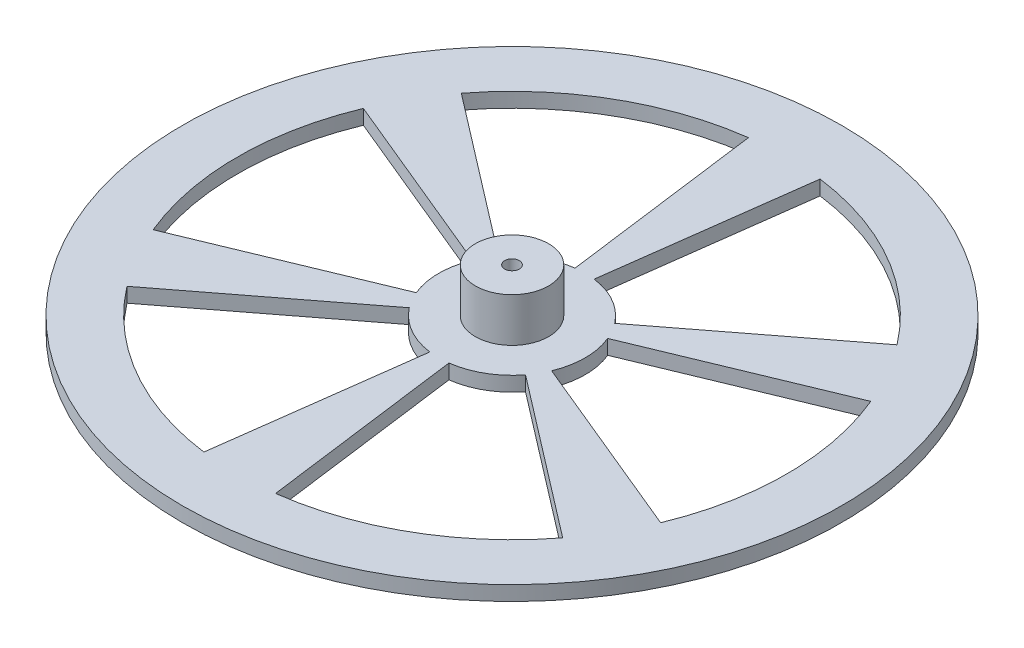
ISO-10303-21;
HEADER;
FILE_DESCRIPTION(('STEP AP214'),'2;1');
FILE_NAME('part.step','',(''),(''),'','','');
FILE_SCHEMA(('AUTOMOTIVE_DESIGN { 1 0 10303 214 1 1 1 1 }'));
ENDSEC;
DATA;
#1=APPLICATION_CONTEXT('core data for automotive mechanical design processes');
#2=APPLICATION_PROTOCOL_DEFINITION('international standard','automotive_design',2000,#1);
#3=PRODUCT_CONTEXT('',#1,'mechanical');
#4=PRODUCT('Part','Part','',(#3));
#5=PRODUCT_RELATED_PRODUCT_CATEGORY('part','',(#4));
#6=PRODUCT_DEFINITION_FORMATION('','',#4);
#7=PRODUCT_DEFINITION_CONTEXT('part definition',#1,'design');
#8=PRODUCT_DEFINITION('design','',#6,#7);
#9=PRODUCT_DEFINITION_SHAPE('','',#8);
#10=(LENGTH_UNIT() NAMED_UNIT(*) SI_UNIT(.MILLI.,.METRE.));
#11=(NAMED_UNIT(*) PLANE_ANGLE_UNIT() SI_UNIT($,.RADIAN.));
#12=(NAMED_UNIT(*) SI_UNIT($,.STERADIAN.) SOLID_ANGLE_UNIT());
#13=UNCERTAINTY_MEASURE_WITH_UNIT(LENGTH_MEASURE(1.E-05),#10,'distance_accuracy_value','');
#14=(GEOMETRIC_REPRESENTATION_CONTEXT(3) GLOBAL_UNCERTAINTY_ASSIGNED_CONTEXT((#13)) GLOBAL_UNIT_ASSIGNED_CONTEXT((#10,
#11,#12)) REPRESENTATION_CONTEXT('',''));
#15=CARTESIAN_POINT('',(0.,0.,0.));
#16=DIRECTION('',(0.,0.,1.));
#17=DIRECTION('',(1.,0.,0.));
#18=AXIS2_PLACEMENT_3D('',#15,#16,#17);
#19=CARTESIAN_POINT('',(0.,4.,0.));
#20=DIRECTION('',(0.,-1.,0.));
#21=DIRECTION('',(0.,0.,-1.));
#22=AXIS2_PLACEMENT_3D('',#19,#20,#21);
#23=CYLINDRICAL_SURFACE('',#22,90.);
#24=CARTESIAN_POINT('',(0.,4.,0.));
#25=DIRECTION('',(0.,1.,0.));
#26=DIRECTION('',(0.,0.,1.));
#27=AXIS2_PLACEMENT_3D('',#24,#25,#26);
#28=CIRCLE('',#27,90.);
#29=CARTESIAN_POINT('',(0.,4.,90.));
#30=VERTEX_POINT('',#29);
#31=EDGE_CURVE('E11',#30,#30,#28,.T.);
#32=ORIENTED_EDGE('',*,*,#31,.F.);
#33=EDGE_LOOP('',(#32));
#34=FACE_BOUND('',#33,.T.);
#35=CARTESIAN_POINT('',(0.,0.,0.));
#36=DIRECTION('',(0.,1.,0.));
#37=DIRECTION('',(0.,0.,1.));
#38=AXIS2_PLACEMENT_3D('',#35,#36,#37);
#39=CIRCLE('',#38,90.);
#40=CARTESIAN_POINT('',(0.,0.,90.));
#41=VERTEX_POINT('',#40);
#42=EDGE_CURVE('E41',#41,#41,#39,.T.);
#43=ORIENTED_EDGE('',*,*,#42,.T.);
#44=EDGE_LOOP('',(#43));
#45=FACE_BOUND('',#44,.T.);
#46=ADVANCED_FACE('F38',(#34,#45),#23,.T.);
#47=CARTESIAN_POINT('',(0.,4.,0.));
#48=DIRECTION('',(0.,1.,0.));
#49=DIRECTION('',(0.,0.,1.));
#50=AXIS2_PLACEMENT_3D('',#47,#48,#49);
#51=PLANE('',#50);
#52=CARTESIAN_POINT('',(0.,4.,0.));
#53=DIRECTION('',(0.,1.,0.));
#54=DIRECTION('',(0.,0.,1.));
#55=AXIS2_PLACEMENT_3D('',#52,#53,#54);
#56=CIRCLE('',#55,10.);
#57=CARTESIAN_POINT('',(0.,4.,10.));
#58=VERTEX_POINT('',#57);
#59=EDGE_CURVE('E228',#58,#58,#56,.T.);
#60=ORIENTED_EDGE('',*,*,#59,.F.);
#61=EDGE_LOOP('',(#60));
#62=FACE_BOUND('',#61,.T.);
#63=DIRECTION('',(-0.793353340291232,0.,0.608761429008725));
#64=VECTOR('',#63,1.);
#65=CARTESIAN_POINT('',(0.,4.,0.));
#66=LINE('',#65,#64);
#67=CARTESIAN_POINT('',(-15.8670668058246,4.,12.1752285801745));
#68=VERTEX_POINT('',#67);
#69=CARTESIAN_POINT('',(-59.5015005218424,4.,45.6571071756544));
#70=VERTEX_POINT('',#69);
#71=EDGE_CURVE('E52',#68,#70,#66,.T.);
#72=ORIENTED_EDGE('',*,*,#71,.F.);
#73=CARTESIAN_POINT('',(0.,4.,0.));
#74=DIRECTION('',(0.,1.,0.));
#75=DIRECTION('',(0.866025403784436,0.,-0.500000000000004));
#76=AXIS2_PLACEMENT_3D('',#73,#74,#75);
#77=CIRCLE('',#76,20.);
#78=CARTESIAN_POINT('',(-2.61052384440089,4.,19.8288972274762));
#79=VERTEX_POINT('',#78);
#80=EDGE_CURVE('E279',#68,#79,#77,.T.);
#81=ORIENTED_EDGE('',*,*,#80,.T.);
#82=DIRECTION('',(-0.130526192220045,0.,0.991444861373812));
#83=VECTOR('',#82,1.);
#84=CARTESIAN_POINT('',(0.,4.,0.));
#85=LINE('',#84,#83);
#86=CARTESIAN_POINT('',(-9.78946441650336,4.,74.3583646030359));
#87=VERTEX_POINT('',#86);
#88=EDGE_CURVE('E293',#79,#87,#85,.T.);
#89=ORIENTED_EDGE('',*,*,#88,.T.);
#90=CARTESIAN_POINT('',(0.,4.,0.));
#91=DIRECTION('',(0.,1.,0.));
#92=DIRECTION('',(0.866025403784436,0.,-0.500000000000004));
#93=AXIS2_PLACEMENT_3D('',#90,#91,#92);
#94=CIRCLE('',#93,75.);
#95=EDGE_CURVE('E289',#70,#87,#94,.T.);
#96=ORIENTED_EDGE('',*,*,#95,.F.);
#97=EDGE_LOOP('',(#72,#81,#89,#96));
#98=FACE_BOUND('',#97,.T.);
#99=DIRECTION('',(0.130526192220053,0.,0.99144486137381));
#100=VECTOR('',#99,1.);
#101=CARTESIAN_POINT('',(0.,4.,0.));
#102=LINE('',#101,#100);
#103=CARTESIAN_POINT('',(2.61052384440105,4.,19.8288972274762));
#104=VERTEX_POINT('',#103);
#105=CARTESIAN_POINT('',(9.78946441650394,4.,74.3583646030358));
#106=VERTEX_POINT('',#105);
#107=EDGE_CURVE('E60',#104,#106,#102,.T.);
#108=ORIENTED_EDGE('',*,*,#107,.F.);
#109=CARTESIAN_POINT('',(0.,4.,0.));
#110=DIRECTION('',(0.,1.,0.));
#111=DIRECTION('',(0.,0.,-1.));
#112=AXIS2_PLACEMENT_3D('',#109,#110,#111);
#113=CIRCLE('',#112,20.);
#114=CARTESIAN_POINT('',(15.8670668058247,4.,12.1752285801744));
#115=VERTEX_POINT('',#114);
#116=EDGE_CURVE('E310',#104,#115,#113,.T.);
#117=ORIENTED_EDGE('',*,*,#116,.T.);
#118=DIRECTION('',(0.793353340291237,0.,0.608761429008719));
#119=VECTOR('',#118,1.);
#120=CARTESIAN_POINT('',(0.,4.,0.));
#121=LINE('',#120,#119);
#122=CARTESIAN_POINT('',(59.5015005218427,4.,45.6571071756539));
#123=VERTEX_POINT('',#122);
#124=EDGE_CURVE('E323',#115,#123,#121,.T.);
#125=ORIENTED_EDGE('',*,*,#124,.T.);
#126=CARTESIAN_POINT('',(0.,4.,0.));
#127=DIRECTION('',(0.,1.,0.));
#128=DIRECTION('',(0.,0.,-1.));
#129=AXIS2_PLACEMENT_3D('',#126,#127,#128);
#130=CIRCLE('',#129,75.);
#131=EDGE_CURVE('E320',#106,#123,#130,.T.);
#132=ORIENTED_EDGE('',*,*,#131,.F.);
#133=EDGE_LOOP('',(#108,#117,#125,#132));
#134=FACE_BOUND('',#133,.T.);
#135=DIRECTION('',(0.793353340291228,0.,-0.608761429008731));
#136=VECTOR('',#135,1.);
#137=CARTESIAN_POINT('',(0.,4.,0.));
#138=LINE('',#137,#136);
#139=CARTESIAN_POINT('',(15.8670668058246,4.,-12.1752285801746));
#140=VERTEX_POINT('',#139);
#141=CARTESIAN_POINT('',(59.5015005218421,4.,-45.6571071756548));
#142=VERTEX_POINT('',#141);
#143=EDGE_CURVE('E205',#140,#142,#138,.T.);
#144=ORIENTED_EDGE('',*,*,#143,.F.);
#145=CARTESIAN_POINT('',(0.,4.,0.));
#146=DIRECTION('',(0.,1.,0.));
#147=DIRECTION('',(-0.866025403784433,0.,0.50000000000001));
#148=AXIS2_PLACEMENT_3D('',#145,#146,#147);
#149=CIRCLE('',#148,20.);
#150=CARTESIAN_POINT('',(2.61052384440075,4.,-19.8288972274762));
#151=VERTEX_POINT('',#150);
#152=EDGE_CURVE('E222',#140,#151,#149,.T.);
#153=ORIENTED_EDGE('',*,*,#152,.T.);
#154=DIRECTION('',(0.130526192220038,0.,-0.991444861373812));
#155=VECTOR('',#154,1.);
#156=CARTESIAN_POINT('',(0.,4.,0.));
#157=LINE('',#156,#155);
#158=CARTESIAN_POINT('',(9.78946441650284,4.,-74.3583646030359));
#159=VERTEX_POINT('',#158);
#160=EDGE_CURVE('E225',#151,#159,#157,.T.);
#161=ORIENTED_EDGE('',*,*,#160,.T.);
#162=CARTESIAN_POINT('',(0.,4.,0.));
#163=DIRECTION('',(0.,1.,0.));
#164=DIRECTION('',(-0.866025403784433,0.,0.50000000000001));
#165=AXIS2_PLACEMENT_3D('',#162,#163,#164);
#166=CIRCLE('',#165,75.);
#167=EDGE_CURVE('E234',#142,#159,#166,.T.);
#168=ORIENTED_EDGE('',*,*,#167,.F.);
#169=EDGE_LOOP('',(#144,#153,#161,#168));
#170=FACE_BOUND('',#169,.T.);
#171=DIRECTION('',(0.923879532511291,0.,0.38268343236508));
#172=VECTOR('',#171,1.);
#173=CARTESIAN_POINT('',(0.,4.,0.));
#174=LINE('',#173,#172);
#175=CARTESIAN_POINT('',(18.4775906502258,4.,7.65366864730161));
#176=VERTEX_POINT('',#175);
#177=CARTESIAN_POINT('',(69.2909649383468,4.,28.701257427381));
#178=VERTEX_POINT('',#177);
#179=EDGE_CURVE('E241',#176,#178,#174,.T.);
#180=ORIENTED_EDGE('',*,*,#179,.F.);
#181=CARTESIAN_POINT('',(0.,4.,0.));
#182=DIRECTION('',(0.,1.,0.));
#183=DIRECTION('',(-0.866025403784443,0.,-0.499999999999992));
#184=AXIS2_PLACEMENT_3D('',#181,#182,#183);
#185=CIRCLE('',#184,20.);
#186=CARTESIAN_POINT('',(18.4775906502256,4.,-7.653668647302));
#187=VERTEX_POINT('',#186);
#188=EDGE_CURVE('E249',#176,#187,#185,.T.);
#189=ORIENTED_EDGE('',*,*,#188,.T.);
#190=DIRECTION('',(0.923879532511282,0.,-0.3826834323651));
#191=VECTOR('',#190,1.);
#192=CARTESIAN_POINT('',(0.,4.,0.));
#193=LINE('',#192,#191);
#194=CARTESIAN_POINT('',(69.2909649383462,4.,-28.7012574273825));
#195=VERTEX_POINT('',#194);
#196=EDGE_CURVE('E262',#187,#195,#193,.T.);
#197=ORIENTED_EDGE('',*,*,#196,.T.);
#198=CARTESIAN_POINT('',(0.,4.,0.));
#199=DIRECTION('',(0.,1.,0.));
#200=DIRECTION('',(-0.866025403784443,0.,-0.499999999999992));
#201=AXIS2_PLACEMENT_3D('',#198,#199,#200);
#202=CIRCLE('',#201,75.);
#203=EDGE_CURVE('E259',#178,#195,#202,.T.);
#204=ORIENTED_EDGE('',*,*,#203,.F.);
#205=EDGE_LOOP('',(#180,#189,#197,#204));
#206=FACE_BOUND('',#205,.T.);
#207=DIRECTION('',(-0.923879532511288,0.,-0.382683432365087));
#208=VECTOR('',#207,1.);
#209=CARTESIAN_POINT('',(0.,4.,0.));
#210=LINE('',#209,#208);
#211=CARTESIAN_POINT('',(-18.4775906502258,4.,-7.65366864730174));
#212=VERTEX_POINT('',#211);
#213=CARTESIAN_POINT('',(-69.2909649383466,4.,-28.7012574273815));
#214=VERTEX_POINT('',#213);
#215=EDGE_CURVE('E300',#212,#214,#210,.T.);
#216=ORIENTED_EDGE('',*,*,#215,.F.);
#217=CARTESIAN_POINT('',(0.,4.,0.));
#218=DIRECTION('',(0.,1.,0.));
#219=DIRECTION('',(0.86602540378444,0.,0.499999999999998));
#220=AXIS2_PLACEMENT_3D('',#217,#218,#219);
#221=CIRCLE('',#220,20.);
#222=CARTESIAN_POINT('',(-18.4775906502257,4.,7.65366864730188));
#223=VERTEX_POINT('',#222);
#224=EDGE_CURVE('E338',#212,#223,#221,.T.);
#225=ORIENTED_EDGE('',*,*,#224,.T.);
#226=DIRECTION('',(-0.923879532511285,0.,0.382683432365094));
#227=VECTOR('',#226,1.);
#228=CARTESIAN_POINT('',(0.,4.,0.));
#229=LINE('',#228,#227);
#230=CARTESIAN_POINT('',(-69.2909649383464,4.,28.701257427382));
#231=VERTEX_POINT('',#230);
#232=EDGE_CURVE('E351',#223,#231,#229,.T.);
#233=ORIENTED_EDGE('',*,*,#232,.T.);
#234=CARTESIAN_POINT('',(0.,4.,0.));
#235=DIRECTION('',(0.,1.,0.));
#236=DIRECTION('',(0.86602540378444,0.,0.499999999999998));
#237=AXIS2_PLACEMENT_3D('',#234,#235,#236);
#238=CIRCLE('',#237,75.);
#239=EDGE_CURVE('E348',#214,#231,#238,.T.);
#240=ORIENTED_EDGE('',*,*,#239,.F.);
#241=EDGE_LOOP('',(#216,#225,#233,#240));
#242=FACE_BOUND('',#241,.T.);
#243=DIRECTION('',(-0.130526192220053,0.,-0.99144486137381));
#244=VECTOR('',#243,1.);
#245=CARTESIAN_POINT('',(0.,4.,0.));
#246=LINE('',#245,#244);
#247=CARTESIAN_POINT('',(-2.61052384440105,4.,-19.8288972274762));
#248=VERTEX_POINT('',#247);
#249=CARTESIAN_POINT('',(-9.78946441650394,4.,-74.3583646030358));
#250=VERTEX_POINT('',#249);
#251=EDGE_CURVE('E358',#248,#250,#246,.T.);
#252=ORIENTED_EDGE('',*,*,#251,.F.);
#253=CARTESIAN_POINT('',(0.,4.,0.));
#254=DIRECTION('',(0.,1.,0.));
#255=DIRECTION('',(0.,0.,1.));
#256=AXIS2_PLACEMENT_3D('',#253,#254,#255);
#257=CIRCLE('',#256,20.);
#258=CARTESIAN_POINT('',(-15.8670668058247,4.,-12.1752285801744));
#259=VERTEX_POINT('',#258);
#260=EDGE_CURVE('E369',#248,#259,#257,.T.);
#261=ORIENTED_EDGE('',*,*,#260,.T.);
#262=DIRECTION('',(-0.793353340291237,0.,-0.608761429008719));
#263=VECTOR('',#262,1.);
#264=CARTESIAN_POINT('',(0.,4.,0.));
#265=LINE('',#264,#263);
#266=CARTESIAN_POINT('',(-59.5015005218427,4.,-45.6571071756539));
#267=VERTEX_POINT('',#266);
#268=EDGE_CURVE('E382',#259,#267,#265,.T.);
#269=ORIENTED_EDGE('',*,*,#268,.T.);
#270=CARTESIAN_POINT('',(0.,4.,0.));
#271=DIRECTION('',(0.,1.,0.));
#272=DIRECTION('',(0.,0.,1.));
#273=AXIS2_PLACEMENT_3D('',#270,#271,#272);
#274=CIRCLE('',#273,75.);
#275=EDGE_CURVE('E379',#250,#267,#274,.T.);
#276=ORIENTED_EDGE('',*,*,#275,.F.);
#277=EDGE_LOOP('',(#252,#261,#269,#276));
#278=FACE_BOUND('',#277,.T.);
#279=ORIENTED_EDGE('',*,*,#31,.T.);
#280=EDGE_LOOP('',(#279));
#281=FACE_BOUND('',#280,.T.);
#282=ADVANCED_FACE('F402',(#62,#98,#134,#170,#206,#242,#278,#281),#51,.T.);
#283=CARTESIAN_POINT('',(0.,0.,0.));
#284=DIRECTION('',(0.,1.,0.));
#285=DIRECTION('',(0.,0.,1.));
#286=AXIS2_PLACEMENT_3D('',#283,#284,#285);
#287=PLANE('',#286);
#288=CARTESIAN_POINT('',(0.,0.,0.));
#289=DIRECTION('',(0.,1.,0.));
#290=DIRECTION('',(0.866025403784436,0.,-0.500000000000004));
#291=AXIS2_PLACEMENT_3D('',#288,#289,#290);
#292=CIRCLE('',#291,20.);
#293=CARTESIAN_POINT('',(-15.8670668058246,0.,12.1752285801745));
#294=VERTEX_POINT('',#293);
#295=CARTESIAN_POINT('',(-2.61052384440089,0.,19.8288972274762));
#296=VERTEX_POINT('',#295);
#297=EDGE_CURVE('E285',#294,#296,#292,.T.);
#298=ORIENTED_EDGE('',*,*,#297,.F.);
#299=DIRECTION('',(-0.793353340291232,0.,0.608761429008725));
#300=VECTOR('',#299,1.);
#301=CARTESIAN_POINT('',(0.,0.,0.));
#302=LINE('',#301,#300);
#303=CARTESIAN_POINT('',(-59.5015005218424,0.,45.6571071756544));
#304=VERTEX_POINT('',#303);
#305=EDGE_CURVE('E275',#294,#304,#302,.T.);
#306=ORIENTED_EDGE('',*,*,#305,.T.);
#307=CARTESIAN_POINT('',(0.,0.,0.));
#308=DIRECTION('',(0.,1.,0.));
#309=DIRECTION('',(0.866025403784436,0.,-0.500000000000004));
#310=AXIS2_PLACEMENT_3D('',#307,#308,#309);
#311=CIRCLE('',#310,75.);
#312=CARTESIAN_POINT('',(-9.78946441650336,0.,74.3583646030359));
#313=VERTEX_POINT('',#312);
#314=EDGE_CURVE('E278',#304,#313,#311,.T.);
#315=ORIENTED_EDGE('',*,*,#314,.T.);
#316=DIRECTION('',(-0.130526192220045,0.,0.991444861373812));
#317=VECTOR('',#316,1.);
#318=CARTESIAN_POINT('',(0.,0.,0.));
#319=LINE('',#318,#317);
#320=EDGE_CURVE('E282',#296,#313,#319,.T.);
#321=ORIENTED_EDGE('',*,*,#320,.F.);
#322=EDGE_LOOP('',(#298,#306,#315,#321));
#323=FACE_BOUND('',#322,.T.);
#324=CARTESIAN_POINT('',(0.,0.,0.));
#325=DIRECTION('',(0.,1.,0.));
#326=DIRECTION('',(0.,0.,-1.));
#327=AXIS2_PLACEMENT_3D('',#324,#325,#326);
#328=CIRCLE('',#327,20.);
#329=CARTESIAN_POINT('',(2.61052384440105,0.,19.8288972274762));
#330=VERTEX_POINT('',#329);
#331=CARTESIAN_POINT('',(15.8670668058247,0.,12.1752285801744));
#332=VERTEX_POINT('',#331);
#333=EDGE_CURVE('E316',#330,#332,#328,.T.);
#334=ORIENTED_EDGE('',*,*,#333,.F.);
#335=DIRECTION('',(0.130526192220053,0.,0.99144486137381));
#336=VECTOR('',#335,1.);
#337=CARTESIAN_POINT('',(0.,0.,0.));
#338=LINE('',#337,#336);
#339=CARTESIAN_POINT('',(9.78946441650394,0.,74.3583646030358));
#340=VERTEX_POINT('',#339);
#341=EDGE_CURVE('E306',#330,#340,#338,.T.);
#342=ORIENTED_EDGE('',*,*,#341,.T.);
#343=CARTESIAN_POINT('',(0.,0.,0.));
#344=DIRECTION('',(0.,1.,0.));
#345=DIRECTION('',(0.,0.,-1.));
#346=AXIS2_PLACEMENT_3D('',#343,#344,#345);
#347=CIRCLE('',#346,75.);
#348=CARTESIAN_POINT('',(59.5015005218427,0.,45.6571071756539));
#349=VERTEX_POINT('',#348);
#350=EDGE_CURVE('E309',#340,#349,#347,.T.);
#351=ORIENTED_EDGE('',*,*,#350,.T.);
#352=DIRECTION('',(0.793353340291237,0.,0.608761429008719));
#353=VECTOR('',#352,1.);
#354=CARTESIAN_POINT('',(0.,0.,0.));
#355=LINE('',#354,#353);
#356=EDGE_CURVE('E313',#332,#349,#355,.T.);
#357=ORIENTED_EDGE('',*,*,#356,.F.);
#358=EDGE_LOOP('',(#334,#342,#351,#357));
#359=FACE_BOUND('',#358,.T.);
#360=CARTESIAN_POINT('',(0.,0.,0.));
#361=DIRECTION('',(0.,1.,0.));
#362=DIRECTION('',(-0.866025403784433,0.,0.50000000000001));
#363=AXIS2_PLACEMENT_3D('',#360,#361,#362);
#364=CIRCLE('',#363,20.);
#365=CARTESIAN_POINT('',(15.8670668058246,0.,-12.1752285801746));
#366=VERTEX_POINT('',#365);
#367=CARTESIAN_POINT('',(2.61052384440075,0.,-19.8288972274762));
#368=VERTEX_POINT('',#367);
#369=EDGE_CURVE('E210',#366,#368,#364,.T.);
#370=ORIENTED_EDGE('',*,*,#369,.F.);
#371=DIRECTION('',(0.793353340291228,0.,-0.608761429008731));
#372=VECTOR('',#371,1.);
#373=CARTESIAN_POINT('',(0.,0.,0.));
#374=LINE('',#373,#372);
#375=CARTESIAN_POINT('',(59.5015005218421,0.,-45.6571071756548));
#376=VERTEX_POINT('',#375);
#377=EDGE_CURVE('E202',#366,#376,#374,.T.);
#378=ORIENTED_EDGE('',*,*,#377,.T.);
#379=CARTESIAN_POINT('',(0.,0.,0.));
#380=DIRECTION('',(0.,1.,0.));
#381=DIRECTION('',(-0.866025403784433,0.,0.50000000000001));
#382=AXIS2_PLACEMENT_3D('',#379,#380,#381);
#383=CIRCLE('',#382,75.);
#384=CARTESIAN_POINT('',(9.78946441650284,0.,-74.3583646030359));
#385=VERTEX_POINT('',#384);
#386=EDGE_CURVE('E213',#376,#385,#383,.T.);
#387=ORIENTED_EDGE('',*,*,#386,.T.);
#388=DIRECTION('',(0.130526192220038,0.,-0.991444861373812));
#389=VECTOR('',#388,1.);
#390=CARTESIAN_POINT('',(0.,0.,0.));
#391=LINE('',#390,#389);
#392=EDGE_CURVE('E218',#368,#385,#391,.T.);
#393=ORIENTED_EDGE('',*,*,#392,.F.);
#394=EDGE_LOOP('',(#370,#378,#387,#393));
#395=FACE_BOUND('',#394,.T.);
#396=CARTESIAN_POINT('',(0.,0.,0.));
#397=DIRECTION('',(0.,1.,0.));
#398=DIRECTION('',(-0.866025403784443,0.,-0.499999999999992));
#399=AXIS2_PLACEMENT_3D('',#396,#397,#398);
#400=CIRCLE('',#399,20.);
#401=CARTESIAN_POINT('',(18.4775906502258,0.,7.65366864730161));
#402=VERTEX_POINT('',#401);
#403=CARTESIAN_POINT('',(18.4775906502256,0.,-7.653668647302));
#404=VERTEX_POINT('',#403);
#405=EDGE_CURVE('E255',#402,#404,#400,.T.);
#406=ORIENTED_EDGE('',*,*,#405,.F.);
#407=DIRECTION('',(0.923879532511291,0.,0.38268343236508));
#408=VECTOR('',#407,1.);
#409=CARTESIAN_POINT('',(0.,0.,0.));
#410=LINE('',#409,#408);
#411=CARTESIAN_POINT('',(69.2909649383468,0.,28.701257427381));
#412=VERTEX_POINT('',#411);
#413=EDGE_CURVE('E245',#402,#412,#410,.T.);
#414=ORIENTED_EDGE('',*,*,#413,.T.);
#415=CARTESIAN_POINT('',(0.,0.,0.));
#416=DIRECTION('',(0.,1.,0.));
#417=DIRECTION('',(-0.866025403784443,0.,-0.499999999999992));
#418=AXIS2_PLACEMENT_3D('',#415,#416,#417);
#419=CIRCLE('',#418,75.);
#420=CARTESIAN_POINT('',(69.2909649383462,0.,-28.7012574273825));
#421=VERTEX_POINT('',#420);
#422=EDGE_CURVE('E248',#412,#421,#419,.T.);
#423=ORIENTED_EDGE('',*,*,#422,.T.);
#424=DIRECTION('',(0.923879532511282,0.,-0.3826834323651));
#425=VECTOR('',#424,1.);
#426=CARTESIAN_POINT('',(0.,0.,0.));
#427=LINE('',#426,#425);
#428=EDGE_CURVE('E252',#404,#421,#427,.T.);
#429=ORIENTED_EDGE('',*,*,#428,.F.);
#430=EDGE_LOOP('',(#406,#414,#423,#429));
#431=FACE_BOUND('',#430,.T.);
#432=CARTESIAN_POINT('',(0.,0.,0.));
#433=DIRECTION('',(0.,1.,0.));
#434=DIRECTION('',(0.86602540378444,0.,0.499999999999998));
#435=AXIS2_PLACEMENT_3D('',#432,#433,#434);
#436=CIRCLE('',#435,20.);
#437=CARTESIAN_POINT('',(-18.4775906502258,0.,-7.65366864730174));
#438=VERTEX_POINT('',#437);
#439=CARTESIAN_POINT('',(-18.4775906502257,0.,7.65366864730188));
#440=VERTEX_POINT('',#439);
#441=EDGE_CURVE('E344',#438,#440,#436,.T.);
#442=ORIENTED_EDGE('',*,*,#441,.F.);
#443=DIRECTION('',(-0.923879532511288,0.,-0.382683432365087));
#444=VECTOR('',#443,1.);
#445=CARTESIAN_POINT('',(0.,0.,0.));
#446=LINE('',#445,#444);
#447=CARTESIAN_POINT('',(-69.2909649383466,0.,-28.7012574273815));
#448=VERTEX_POINT('',#447);
#449=EDGE_CURVE('E334',#438,#448,#446,.T.);
#450=ORIENTED_EDGE('',*,*,#449,.T.);
#451=CARTESIAN_POINT('',(0.,0.,0.));
#452=DIRECTION('',(0.,1.,0.));
#453=DIRECTION('',(0.86602540378444,0.,0.499999999999998));
#454=AXIS2_PLACEMENT_3D('',#451,#452,#453);
#455=CIRCLE('',#454,75.);
#456=CARTESIAN_POINT('',(-69.2909649383464,0.,28.701257427382));
#457=VERTEX_POINT('',#456);
#458=EDGE_CURVE('E337',#448,#457,#455,.T.);
#459=ORIENTED_EDGE('',*,*,#458,.T.);
#460=DIRECTION('',(-0.923879532511285,0.,0.382683432365094));
#461=VECTOR('',#460,1.);
#462=CARTESIAN_POINT('',(0.,0.,0.));
#463=LINE('',#462,#461);
#464=EDGE_CURVE('E341',#440,#457,#463,.T.);
#465=ORIENTED_EDGE('',*,*,#464,.F.);
#466=EDGE_LOOP('',(#442,#450,#459,#465));
#467=FACE_BOUND('',#466,.T.);
#468=CARTESIAN_POINT('',(0.,0.,0.));
#469=DIRECTION('',(0.,1.,0.));
#470=DIRECTION('',(0.,0.,1.));
#471=AXIS2_PLACEMENT_3D('',#468,#469,#470);
#472=CIRCLE('',#471,20.);
#473=CARTESIAN_POINT('',(-2.61052384440105,0.,-19.8288972274762));
#474=VERTEX_POINT('',#473);
#475=CARTESIAN_POINT('',(-15.8670668058247,0.,-12.1752285801744));
#476=VERTEX_POINT('',#475);
#477=EDGE_CURVE('E375',#474,#476,#472,.T.);
#478=ORIENTED_EDGE('',*,*,#477,.F.);
#479=DIRECTION('',(-0.130526192220053,0.,-0.99144486137381));
#480=VECTOR('',#479,1.);
#481=CARTESIAN_POINT('',(0.,0.,0.));
#482=LINE('',#481,#480);
#483=CARTESIAN_POINT('',(-9.78946441650394,0.,-74.3583646030358));
#484=VERTEX_POINT('',#483);
#485=EDGE_CURVE('E365',#474,#484,#482,.T.);
#486=ORIENTED_EDGE('',*,*,#485,.T.);
#487=CARTESIAN_POINT('',(0.,0.,0.));
#488=DIRECTION('',(0.,1.,0.));
#489=DIRECTION('',(0.,0.,1.));
#490=AXIS2_PLACEMENT_3D('',#487,#488,#489);
#491=CIRCLE('',#490,75.);
#492=CARTESIAN_POINT('',(-59.5015005218427,0.,-45.6571071756539));
#493=VERTEX_POINT('',#492);
#494=EDGE_CURVE('E368',#484,#493,#491,.T.);
#495=ORIENTED_EDGE('',*,*,#494,.T.);
#496=DIRECTION('',(-0.793353340291237,0.,-0.608761429008719));
#497=VECTOR('',#496,1.);
#498=CARTESIAN_POINT('',(0.,0.,0.));
#499=LINE('',#498,#497);
#500=EDGE_CURVE('E372',#476,#493,#499,.T.);
#501=ORIENTED_EDGE('',*,*,#500,.F.);
#502=EDGE_LOOP('',(#478,#486,#495,#501));
#503=FACE_BOUND('',#502,.T.);
#504=ORIENTED_EDGE('',*,*,#42,.F.);
#505=EDGE_LOOP('',(#504));
#506=FACE_BOUND('',#505,.T.);
#507=ADVANCED_FACE('F220',(#323,#359,#395,#431,#467,#503,#506),#287,.F.);
#508=CARTESIAN_POINT('',(0.,0.,0.));
#509=DIRECTION('',(0.99144486137381,0.,-0.130526192220053));
#510=DIRECTION('',(-0.130526192220053,0.,-0.99144486137381));
#511=AXIS2_PLACEMENT_3D('',#508,#509,#510);
#512=PLANE('',#511);
#513=ORIENTED_EDGE('',*,*,#251,.T.);
#514=DIRECTION('',(0.,1.,0.));
#515=VECTOR('',#514,1.);
#516=CARTESIAN_POINT('',(-9.78946441650394,0.,-74.3583646030358));
#517=LINE('',#516,#515);
#518=EDGE_CURVE('E377',#484,#250,#517,.T.);
#519=ORIENTED_EDGE('',*,*,#518,.F.);
#520=ORIENTED_EDGE('',*,*,#485,.F.);
#521=DIRECTION('',(0.,1.,0.));
#522=VECTOR('',#521,1.);
#523=CARTESIAN_POINT('',(-2.61052384440105,0.,-19.8288972274762));
#524=LINE('',#523,#522);
#525=EDGE_CURVE('E387',#474,#248,#524,.T.);
#526=ORIENTED_EDGE('',*,*,#525,.T.);
#527=EDGE_LOOP('',(#513,#519,#520,#526));
#528=FACE_BOUND('',#527,.T.);
#529=ADVANCED_FACE('F413',(#528),#512,.F.);
#530=CARTESIAN_POINT('',(0.,0.,0.));
#531=DIRECTION('',(0.,1.,0.));
#532=DIRECTION('',(0.,0.,1.));
#533=AXIS2_PLACEMENT_3D('',#530,#531,#532);
#534=CYLINDRICAL_SURFACE('',#533,20.);
#535=ORIENTED_EDGE('',*,*,#260,.F.);
#536=ORIENTED_EDGE('',*,*,#525,.F.);
#537=ORIENTED_EDGE('',*,*,#477,.T.);
#538=DIRECTION('',(0.,1.,0.));
#539=VECTOR('',#538,1.);
#540=CARTESIAN_POINT('',(-15.8670668058247,0.,-12.1752285801744));
#541=LINE('',#540,#539);
#542=EDGE_CURVE('E389',#476,#259,#541,.T.);
#543=ORIENTED_EDGE('',*,*,#542,.T.);
#544=EDGE_LOOP('',(#535,#536,#537,#543));
#545=FACE_BOUND('',#544,.T.);
#546=ADVANCED_FACE('F415',(#545),#534,.T.);
#547=CARTESIAN_POINT('',(0.,0.,0.));
#548=DIRECTION('',(0.608761429008719,0.,-0.793353340291237));
#549=DIRECTION('',(-0.793353340291236,0.,-0.608761429008719));
#550=AXIS2_PLACEMENT_3D('',#547,#548,#549);
#551=PLANE('',#550);
#552=ORIENTED_EDGE('',*,*,#268,.F.);
#553=ORIENTED_EDGE('',*,*,#542,.F.);
#554=ORIENTED_EDGE('',*,*,#500,.T.);
#555=DIRECTION('',(0.,1.,0.));
#556=VECTOR('',#555,1.);
#557=CARTESIAN_POINT('',(-59.5015005218427,0.,-45.6571071756539));
#558=LINE('',#557,#556);
#559=EDGE_CURVE('E391',#493,#267,#558,.T.);
#560=ORIENTED_EDGE('',*,*,#559,.T.);
#561=EDGE_LOOP('',(#552,#553,#554,#560));
#562=FACE_BOUND('',#561,.T.);
#563=ADVANCED_FACE('F408',(#562),#551,.T.);
#564=CARTESIAN_POINT('',(0.,0.,0.));
#565=DIRECTION('',(0.,1.,0.));
#566=DIRECTION('',(0.,0.,1.));
#567=AXIS2_PLACEMENT_3D('',#564,#565,#566);
#568=CYLINDRICAL_SURFACE('',#567,75.);
#569=ORIENTED_EDGE('',*,*,#275,.T.);
#570=ORIENTED_EDGE('',*,*,#559,.F.);
#571=ORIENTED_EDGE('',*,*,#494,.F.);
#572=ORIENTED_EDGE('',*,*,#518,.T.);
#573=EDGE_LOOP('',(#569,#570,#571,#572));
#574=FACE_BOUND('',#573,.T.);
#575=ADVANCED_FACE('F397',(#574),#568,.F.);
#576=CARTESIAN_POINT('',(0.,0.,0.));
#577=DIRECTION('',(0.382683432365087,0.,-0.923879532511288));
#578=DIRECTION('',(-0.923879532511288,0.,-0.382683432365087));
#579=AXIS2_PLACEMENT_3D('',#576,#577,#578);
#580=PLANE('',#579);
#581=ORIENTED_EDGE('',*,*,#215,.T.);
#582=DIRECTION('',(0.,1.,0.));
#583=VECTOR('',#582,1.);
#584=CARTESIAN_POINT('',(-69.2909649383466,0.,-28.7012574273815));
#585=LINE('',#584,#583);
#586=EDGE_CURVE('E346',#448,#214,#585,.T.);
#587=ORIENTED_EDGE('',*,*,#586,.F.);
#588=ORIENTED_EDGE('',*,*,#449,.F.);
#589=DIRECTION('',(0.,1.,0.));
#590=VECTOR('',#589,1.);
#591=CARTESIAN_POINT('',(-18.4775906502258,0.,-7.65366864730174));
#592=LINE('',#591,#590);
#593=EDGE_CURVE('E356',#438,#212,#592,.T.);
#594=ORIENTED_EDGE('',*,*,#593,.T.);
#595=EDGE_LOOP('',(#581,#587,#588,#594));
#596=FACE_BOUND('',#595,.T.);
#597=ADVANCED_FACE('F444',(#596),#580,.F.);
#598=CARTESIAN_POINT('',(0.,0.,0.));
#599=DIRECTION('',(0.,1.,0.));
#600=DIRECTION('',(0.,0.,1.));
#601=AXIS2_PLACEMENT_3D('',#598,#599,#600);
#602=CYLINDRICAL_SURFACE('',#601,20.);
#603=ORIENTED_EDGE('',*,*,#224,.F.);
#604=ORIENTED_EDGE('',*,*,#593,.F.);
#605=ORIENTED_EDGE('',*,*,#441,.T.);
#606=DIRECTION('',(0.,1.,0.));
#607=VECTOR('',#606,1.);
#608=CARTESIAN_POINT('',(-18.4775906502257,0.,7.65366864730188));
#609=LINE('',#608,#607);
#610=EDGE_CURVE('E359',#440,#223,#609,.T.);
#611=ORIENTED_EDGE('',*,*,#610,.T.);
#612=EDGE_LOOP('',(#603,#604,#605,#611));
#613=FACE_BOUND('',#612,.T.);
#614=ADVANCED_FACE('F448',(#613),#602,.T.);
#615=CARTESIAN_POINT('',(0.,0.,0.));
#616=DIRECTION('',(-0.382683432365094,0.,-0.923879532511285));
#617=DIRECTION('',(-0.923879532511285,0.,0.382683432365094));
#618=AXIS2_PLACEMENT_3D('',#615,#616,#617);
#619=PLANE('',#618);
#620=ORIENTED_EDGE('',*,*,#232,.F.);
#621=ORIENTED_EDGE('',*,*,#610,.F.);
#622=ORIENTED_EDGE('',*,*,#464,.T.);
#623=DIRECTION('',(0.,1.,0.));
#624=VECTOR('',#623,1.);
#625=CARTESIAN_POINT('',(-69.2909649383464,0.,28.701257427382));
#626=LINE('',#625,#624);
#627=EDGE_CURVE('E361',#457,#231,#626,.T.);
#628=ORIENTED_EDGE('',*,*,#627,.T.);
#629=EDGE_LOOP('',(#620,#621,#622,#628));
#630=FACE_BOUND('',#629,.T.);
#631=ADVANCED_FACE('F453',(#630),#619,.T.);
#632=CARTESIAN_POINT('',(0.,0.,0.));
#633=DIRECTION('',(0.,1.,0.));
#634=DIRECTION('',(0.,0.,1.));
#635=AXIS2_PLACEMENT_3D('',#632,#633,#634);
#636=CYLINDRICAL_SURFACE('',#635,75.);
#637=ORIENTED_EDGE('',*,*,#239,.T.);
#638=ORIENTED_EDGE('',*,*,#627,.F.);
#639=ORIENTED_EDGE('',*,*,#458,.F.);
#640=ORIENTED_EDGE('',*,*,#586,.T.);
#641=EDGE_LOOP('',(#637,#638,#639,#640));
#642=FACE_BOUND('',#641,.T.);
#643=ADVANCED_FACE('F457',(#642),#636,.F.);
#644=CARTESIAN_POINT('',(0.,0.,0.));
#645=DIRECTION('',(-0.38268343236508,0.,0.923879532511291));
#646=DIRECTION('',(0.923879532511291,0.,0.38268343236508));
#647=AXIS2_PLACEMENT_3D('',#644,#645,#646);
#648=PLANE('',#647);
#649=ORIENTED_EDGE('',*,*,#179,.T.);
#650=DIRECTION('',(0.,1.,0.));
#651=VECTOR('',#650,1.);
#652=CARTESIAN_POINT('',(69.2909649383468,0.,28.701257427381));
#653=LINE('',#652,#651);
#654=EDGE_CURVE('E257',#412,#178,#653,.T.);
#655=ORIENTED_EDGE('',*,*,#654,.F.);
#656=ORIENTED_EDGE('',*,*,#413,.F.);
#657=DIRECTION('',(0.,1.,0.));
#658=VECTOR('',#657,1.);
#659=CARTESIAN_POINT('',(18.4775906502258,0.,7.65366864730161));
#660=LINE('',#659,#658);
#661=EDGE_CURVE('E267',#402,#176,#660,.T.);
#662=ORIENTED_EDGE('',*,*,#661,.T.);
#663=EDGE_LOOP('',(#649,#655,#656,#662));
#664=FACE_BOUND('',#663,.T.);
#665=ADVANCED_FACE('F460',(#664),#648,.F.);
#666=CARTESIAN_POINT('',(0.,0.,0.));
#667=DIRECTION('',(0.,1.,0.));
#668=DIRECTION('',(0.,0.,1.));
#669=AXIS2_PLACEMENT_3D('',#666,#667,#668);
#670=CYLINDRICAL_SURFACE('',#669,20.);
#671=ORIENTED_EDGE('',*,*,#188,.F.);
#672=ORIENTED_EDGE('',*,*,#661,.F.);
#673=ORIENTED_EDGE('',*,*,#405,.T.);
#674=DIRECTION('',(0.,1.,0.));
#675=VECTOR('',#674,1.);
#676=CARTESIAN_POINT('',(18.4775906502256,0.,-7.653668647302));
#677=LINE('',#676,#675);
#678=EDGE_CURVE('E269',#404,#187,#677,.T.);
#679=ORIENTED_EDGE('',*,*,#678,.T.);
#680=EDGE_LOOP('',(#671,#672,#673,#679));
#681=FACE_BOUND('',#680,.T.);
#682=ADVANCED_FACE('F498',(#681),#670,.T.);
#683=CARTESIAN_POINT('',(0.,0.,0.));
#684=DIRECTION('',(0.3826834323651,0.,0.923879532511282));
#685=DIRECTION('',(0.923879532511282,0.,-0.3826834323651));
#686=AXIS2_PLACEMENT_3D('',#683,#684,#685);
#687=PLANE('',#686);
#688=ORIENTED_EDGE('',*,*,#196,.F.);
#689=ORIENTED_EDGE('',*,*,#678,.F.);
#690=ORIENTED_EDGE('',*,*,#428,.T.);
#691=DIRECTION('',(0.,1.,0.));
#692=VECTOR('',#691,1.);
#693=CARTESIAN_POINT('',(69.2909649383462,0.,-28.7012574273825));
#694=LINE('',#693,#692);
#695=EDGE_CURVE('E271',#421,#195,#694,.T.);
#696=ORIENTED_EDGE('',*,*,#695,.T.);
#697=EDGE_LOOP('',(#688,#689,#690,#696));
#698=FACE_BOUND('',#697,.T.);
#699=ADVANCED_FACE('F503',(#698),#687,.T.);
#700=CARTESIAN_POINT('',(0.,0.,0.));
#701=DIRECTION('',(0.,1.,0.));
#702=DIRECTION('',(0.,0.,1.));
#703=AXIS2_PLACEMENT_3D('',#700,#701,#702);
#704=CYLINDRICAL_SURFACE('',#703,75.);
#705=ORIENTED_EDGE('',*,*,#203,.T.);
#706=ORIENTED_EDGE('',*,*,#695,.F.);
#707=ORIENTED_EDGE('',*,*,#422,.F.);
#708=ORIENTED_EDGE('',*,*,#654,.T.);
#709=EDGE_LOOP('',(#705,#706,#707,#708));
#710=FACE_BOUND('',#709,.T.);
#711=ADVANCED_FACE('F500',(#710),#704,.F.);
#712=CARTESIAN_POINT('',(0.,0.,0.));
#713=DIRECTION('',(0.608761429008731,0.,0.793353340291228));
#714=DIRECTION('',(0.793353340291228,0.,-0.608761429008731));
#715=AXIS2_PLACEMENT_3D('',#712,#713,#714);
#716=PLANE('',#715);
#717=ORIENTED_EDGE('',*,*,#143,.T.);
#718=DIRECTION('',(0.,1.,0.));
#719=VECTOR('',#718,1.);
#720=CARTESIAN_POINT('',(59.5015005218421,0.,-45.6571071756548));
#721=LINE('',#720,#719);
#722=EDGE_CURVE('E198',#376,#142,#721,.T.);
#723=ORIENTED_EDGE('',*,*,#722,.F.);
#724=ORIENTED_EDGE('',*,*,#377,.F.);
#725=DIRECTION('',(0.,1.,0.));
#726=VECTOR('',#725,1.);
#727=CARTESIAN_POINT('',(15.8670668058246,0.,-12.1752285801746));
#728=LINE('',#727,#726);
#729=EDGE_CURVE('E239',#366,#140,#728,.T.);
#730=ORIENTED_EDGE('',*,*,#729,.T.);
#731=EDGE_LOOP('',(#717,#723,#724,#730));
#732=FACE_BOUND('',#731,.T.);
#733=ADVANCED_FACE('F200',(#732),#716,.F.);
#734=CARTESIAN_POINT('',(0.,0.,0.));
#735=DIRECTION('',(0.,1.,0.));
#736=DIRECTION('',(0.,0.,1.));
#737=AXIS2_PLACEMENT_3D('',#734,#735,#736);
#738=CYLINDRICAL_SURFACE('',#737,20.);
#739=ORIENTED_EDGE('',*,*,#152,.F.);
#740=ORIENTED_EDGE('',*,*,#729,.F.);
#741=ORIENTED_EDGE('',*,*,#369,.T.);
#742=DIRECTION('',(0.,1.,0.));
#743=VECTOR('',#742,1.);
#744=CARTESIAN_POINT('',(2.61052384440075,0.,-19.8288972274762));
#745=LINE('',#744,#743);
#746=EDGE_CURVE('E242',#368,#151,#745,.T.);
#747=ORIENTED_EDGE('',*,*,#746,.T.);
#748=EDGE_LOOP('',(#739,#740,#741,#747));
#749=FACE_BOUND('',#748,.T.);
#750=ADVANCED_FACE('F513',(#749),#738,.T.);
#751=CARTESIAN_POINT('',(0.,0.,0.));
#752=DIRECTION('',(0.991444861373812,0.,0.130526192220038));
#753=DIRECTION('',(0.130526192220038,0.,-0.991444861373812));
#754=AXIS2_PLACEMENT_3D('',#751,#752,#753);
#755=PLANE('',#754);
#756=ORIENTED_EDGE('',*,*,#160,.F.);
#757=ORIENTED_EDGE('',*,*,#746,.F.);
#758=ORIENTED_EDGE('',*,*,#392,.T.);
#759=DIRECTION('',(0.,1.,0.));
#760=VECTOR('',#759,1.);
#761=CARTESIAN_POINT('',(9.78946441650284,0.,-74.3583646030359));
#762=LINE('',#761,#760);
#763=EDGE_CURVE('E209',#385,#159,#762,.T.);
#764=ORIENTED_EDGE('',*,*,#763,.T.);
#765=EDGE_LOOP('',(#756,#757,#758,#764));
#766=FACE_BOUND('',#765,.T.);
#767=ADVANCED_FACE('F516',(#766),#755,.T.);
#768=CARTESIAN_POINT('',(0.,0.,0.));
#769=DIRECTION('',(0.,1.,0.));
#770=DIRECTION('',(0.,0.,1.));
#771=AXIS2_PLACEMENT_3D('',#768,#769,#770);
#772=CYLINDRICAL_SURFACE('',#771,75.);
#773=ORIENTED_EDGE('',*,*,#167,.T.);
#774=ORIENTED_EDGE('',*,*,#763,.F.);
#775=ORIENTED_EDGE('',*,*,#386,.F.);
#776=ORIENTED_EDGE('',*,*,#722,.T.);
#777=EDGE_LOOP('',(#773,#774,#775,#776));
#778=FACE_BOUND('',#777,.T.);
#779=ADVANCED_FACE('F214',(#778),#772,.F.);
#780=CARTESIAN_POINT('',(0.,0.,0.));
#781=DIRECTION('',(-0.99144486137381,0.,0.130526192220053));
#782=DIRECTION('',(0.130526192220053,0.,0.99144486137381));
#783=AXIS2_PLACEMENT_3D('',#780,#781,#782);
#784=PLANE('',#783);
#785=ORIENTED_EDGE('',*,*,#107,.T.);
#786=DIRECTION('',(0.,1.,0.));
#787=VECTOR('',#786,1.);
#788=CARTESIAN_POINT('',(9.78946441650394,0.,74.3583646030358));
#789=LINE('',#788,#787);
#790=EDGE_CURVE('E318',#340,#106,#789,.T.);
#791=ORIENTED_EDGE('',*,*,#790,.F.);
#792=ORIENTED_EDGE('',*,*,#341,.F.);
#793=DIRECTION('',(0.,1.,0.));
#794=VECTOR('',#793,1.);
#795=CARTESIAN_POINT('',(2.61052384440105,0.,19.8288972274762));
#796=LINE('',#795,#794);
#797=EDGE_CURVE('E290',#330,#104,#796,.T.);
#798=ORIENTED_EDGE('',*,*,#797,.T.);
#799=EDGE_LOOP('',(#785,#791,#792,#798));
#800=FACE_BOUND('',#799,.T.);
#801=ADVANCED_FACE('F465',(#800),#784,.F.);
#802=CARTESIAN_POINT('',(0.,0.,0.));
#803=DIRECTION('',(0.,1.,0.));
#804=DIRECTION('',(0.,0.,1.));
#805=AXIS2_PLACEMENT_3D('',#802,#803,#804);
#806=CYLINDRICAL_SURFACE('',#805,20.);
#807=ORIENTED_EDGE('',*,*,#116,.F.);
#808=ORIENTED_EDGE('',*,*,#797,.F.);
#809=ORIENTED_EDGE('',*,*,#333,.T.);
#810=DIRECTION('',(0.,1.,0.));
#811=VECTOR('',#810,1.);
#812=CARTESIAN_POINT('',(15.8670668058247,0.,12.1752285801744));
#813=LINE('',#812,#811);
#814=EDGE_CURVE('E329',#332,#115,#813,.T.);
#815=ORIENTED_EDGE('',*,*,#814,.T.);
#816=EDGE_LOOP('',(#807,#808,#809,#815));
#817=FACE_BOUND('',#816,.T.);
#818=ADVANCED_FACE('F468',(#817),#806,.T.);
#819=CARTESIAN_POINT('',(0.,0.,0.));
#820=DIRECTION('',(-0.608761429008719,0.,0.793353340291237));
#821=DIRECTION('',(0.793353340291236,0.,0.608761429008719));
#822=AXIS2_PLACEMENT_3D('',#819,#820,#821);
#823=PLANE('',#822);
#824=ORIENTED_EDGE('',*,*,#124,.F.);
#825=ORIENTED_EDGE('',*,*,#814,.F.);
#826=ORIENTED_EDGE('',*,*,#356,.T.);
#827=DIRECTION('',(0.,1.,0.));
#828=VECTOR('',#827,1.);
#829=CARTESIAN_POINT('',(59.5015005218427,0.,45.6571071756539));
#830=LINE('',#829,#828);
#831=EDGE_CURVE('E331',#349,#123,#830,.T.);
#832=ORIENTED_EDGE('',*,*,#831,.T.);
#833=EDGE_LOOP('',(#824,#825,#826,#832));
#834=FACE_BOUND('',#833,.T.);
#835=ADVANCED_FACE('F473',(#834),#823,.T.);
#836=CARTESIAN_POINT('',(0.,0.,0.));
#837=DIRECTION('',(0.,1.,0.));
#838=DIRECTION('',(0.,0.,1.));
#839=AXIS2_PLACEMENT_3D('',#836,#837,#838);
#840=CYLINDRICAL_SURFACE('',#839,75.);
#841=ORIENTED_EDGE('',*,*,#131,.T.);
#842=ORIENTED_EDGE('',*,*,#831,.F.);
#843=ORIENTED_EDGE('',*,*,#350,.F.);
#844=ORIENTED_EDGE('',*,*,#790,.T.);
#845=EDGE_LOOP('',(#841,#842,#843,#844));
#846=FACE_BOUND('',#845,.T.);
#847=ADVANCED_FACE('F469',(#846),#840,.F.);
#848=CARTESIAN_POINT('',(0.,0.,0.));
#849=DIRECTION('',(-0.608761429008725,0.,-0.793353340291232));
#850=DIRECTION('',(-0.793353340291232,0.,0.608761429008725));
#851=AXIS2_PLACEMENT_3D('',#848,#849,#850);
#852=PLANE('',#851);
#853=ORIENTED_EDGE('',*,*,#71,.T.);
#854=DIRECTION('',(0.,1.,0.));
#855=VECTOR('',#854,1.);
#856=CARTESIAN_POINT('',(-59.5015005218424,0.,45.6571071756544));
#857=LINE('',#856,#855);
#858=EDGE_CURVE('E287',#304,#70,#857,.T.);
#859=ORIENTED_EDGE('',*,*,#858,.F.);
#860=ORIENTED_EDGE('',*,*,#305,.F.);
#861=DIRECTION('',(0.,1.,0.));
#862=VECTOR('',#861,1.);
#863=CARTESIAN_POINT('',(-15.8670668058246,0.,12.1752285801745));
#864=LINE('',#863,#862);
#865=EDGE_CURVE('E298',#294,#68,#864,.T.);
#866=ORIENTED_EDGE('',*,*,#865,.T.);
#867=EDGE_LOOP('',(#853,#859,#860,#866));
#868=FACE_BOUND('',#867,.T.);
#869=ADVANCED_FACE('F472',(#868),#852,.F.);
#870=CARTESIAN_POINT('',(0.,0.,0.));
#871=DIRECTION('',(0.,1.,0.));
#872=DIRECTION('',(0.,0.,1.));
#873=AXIS2_PLACEMENT_3D('',#870,#871,#872);
#874=CYLINDRICAL_SURFACE('',#873,20.);
#875=ORIENTED_EDGE('',*,*,#80,.F.);
#876=ORIENTED_EDGE('',*,*,#865,.F.);
#877=ORIENTED_EDGE('',*,*,#297,.T.);
#878=DIRECTION('',(0.,1.,0.));
#879=VECTOR('',#878,1.);
#880=CARTESIAN_POINT('',(-2.61052384440089,0.,19.8288972274762));
#881=LINE('',#880,#879);
#882=EDGE_CURVE('E301',#296,#79,#881,.T.);
#883=ORIENTED_EDGE('',*,*,#882,.T.);
#884=EDGE_LOOP('',(#875,#876,#877,#883));
#885=FACE_BOUND('',#884,.T.);
#886=ADVANCED_FACE('F483',(#885),#874,.T.);
#887=CARTESIAN_POINT('',(0.,0.,0.));
#888=DIRECTION('',(-0.991444861373811,0.,-0.130526192220045));
#889=DIRECTION('',(-0.130526192220045,0.,0.991444861373811));
#890=AXIS2_PLACEMENT_3D('',#887,#888,#889);
#891=PLANE('',#890);
#892=ORIENTED_EDGE('',*,*,#88,.F.);
#893=ORIENTED_EDGE('',*,*,#882,.F.);
#894=ORIENTED_EDGE('',*,*,#320,.T.);
#895=DIRECTION('',(0.,1.,0.));
#896=VECTOR('',#895,1.);
#897=CARTESIAN_POINT('',(-9.78946441650336,0.,74.3583646030359));
#898=LINE('',#897,#896);
#899=EDGE_CURVE('E303',#313,#87,#898,.T.);
#900=ORIENTED_EDGE('',*,*,#899,.T.);
#901=EDGE_LOOP('',(#892,#893,#894,#900));
#902=FACE_BOUND('',#901,.T.);
#903=ADVANCED_FACE('F488',(#902),#891,.T.);
#904=CARTESIAN_POINT('',(0.,0.,0.));
#905=DIRECTION('',(0.,1.,0.));
#906=DIRECTION('',(0.,0.,1.));
#907=AXIS2_PLACEMENT_3D('',#904,#905,#906);
#908=CYLINDRICAL_SURFACE('',#907,75.);
#909=ORIENTED_EDGE('',*,*,#95,.T.);
#910=ORIENTED_EDGE('',*,*,#899,.F.);
#911=ORIENTED_EDGE('',*,*,#314,.F.);
#912=ORIENTED_EDGE('',*,*,#858,.T.);
#913=EDGE_LOOP('',(#909,#910,#911,#912));
#914=FACE_BOUND('',#913,.T.);
#915=ADVANCED_FACE('F484',(#914),#908,.F.);
#916=CARTESIAN_POINT('',(0.,16.,0.));
#917=DIRECTION('',(0.,-1.,0.));
#918=DIRECTION('',(0.,0.,-1.));
#919=AXIS2_PLACEMENT_3D('',#916,#917,#918);
#920=CYLINDRICAL_SURFACE('',#919,10.);
#921=CARTESIAN_POINT('',(0.,16.,0.));
#922=DIRECTION('',(0.,1.,0.));
#923=DIRECTION('',(0.,0.,1.));
#924=AXIS2_PLACEMENT_3D('',#921,#922,#923);
#925=CIRCLE('',#924,10.);
#926=CARTESIAN_POINT('',(0.,16.,10.));
#927=VERTEX_POINT('',#926);
#928=EDGE_CURVE('E235',#927,#927,#925,.T.);
#929=ORIENTED_EDGE('',*,*,#928,.F.);
#930=EDGE_LOOP('',(#929));
#931=FACE_BOUND('',#930,.T.);
#932=ORIENTED_EDGE('',*,*,#59,.T.);
#933=EDGE_LOOP('',(#932));
#934=FACE_BOUND('',#933,.T.);
#935=ADVANCED_FACE('F487',(#931,#934),#920,.T.);
#936=CARTESIAN_POINT('',(0.,16.,0.));
#937=DIRECTION('',(0.,1.,0.));
#938=DIRECTION('',(0.,0.,1.));
#939=AXIS2_PLACEMENT_3D('',#936,#937,#938);
#940=PLANE('',#939);
#941=CARTESIAN_POINT('',(0.,16.,0.));
#942=DIRECTION('',(0.,1.,0.));
#943=DIRECTION('',(0.,0.,1.));
#944=AXIS2_PLACEMENT_3D('',#941,#942,#943);
#945=CIRCLE('',#944,2.);
#946=CARTESIAN_POINT('',(0.,16.,2.));
#947=VERTEX_POINT('',#946);
#948=EDGE_CURVE('E542',#947,#947,#945,.T.);
#949=ORIENTED_EDGE('',*,*,#948,.F.);
#950=EDGE_LOOP('',(#949));
#951=FACE_BOUND('',#950,.T.);
#952=ORIENTED_EDGE('',*,*,#928,.T.);
#953=EDGE_LOOP('',(#952));
#954=FACE_BOUND('',#953,.T.);
#955=ADVANCED_FACE('F525',(#951,#954),#940,.T.);
#956=CARTESIAN_POINT('',(0.,4.,0.));
#957=DIRECTION('',(0.,1.,0.));
#958=DIRECTION('',(0.,0.,1.));
#959=AXIS2_PLACEMENT_3D('',#956,#957,#958);
#960=CYLINDRICAL_SURFACE('',#959,2.);
#961=CARTESIAN_POINT('',(0.,4.,0.));
#962=DIRECTION('',(0.,1.,0.));
#963=DIRECTION('',(0.,0.,1.));
#964=AXIS2_PLACEMENT_3D('',#961,#962,#963);
#965=CIRCLE('',#964,2.);
#966=CARTESIAN_POINT('',(0.,4.,2.));
#967=VERTEX_POINT('',#966);
#968=EDGE_CURVE('E541',#967,#967,#965,.T.);
#969=ORIENTED_EDGE('',*,*,#968,.F.);
#970=EDGE_LOOP('',(#969));
#971=FACE_BOUND('',#970,.T.);
#972=ORIENTED_EDGE('',*,*,#948,.T.);
#973=EDGE_LOOP('',(#972));
#974=FACE_BOUND('',#973,.T.);
#975=ADVANCED_FACE('F529',(#971,#974),#960,.F.);
#976=CARTESIAN_POINT('',(0.,4.,0.));
#977=DIRECTION('',(0.,1.,0.));
#978=DIRECTION('',(0.,0.,1.));
#979=AXIS2_PLACEMENT_3D('',#976,#977,#978);
#980=PLANE('',#979);
#981=ORIENTED_EDGE('',*,*,#968,.T.);
#982=EDGE_LOOP('',(#981));
#983=FACE_BOUND('',#982,.T.);
#984=ADVANCED_FACE('F533',(#983),#980,.T.);
#985=CLOSED_SHELL('',(#46,#282,#507,#529,#546,#563,#575,#597,#614,#631,#643,#665,#682,#699,#711,
#733,#750,#767,#779,#801,#818,#835,#847,#869,#886,#903,#915,#935,#955,#975,#984));
#986=MANIFOLD_SOLID_BREP('B2',#985);
#987=ADVANCED_BREP_SHAPE_REPRESENTATION('',(#18,#986),#14);
#988=SHAPE_DEFINITION_REPRESENTATION(#9,#987);
ENDSEC;
END-ISO-10303-21;
